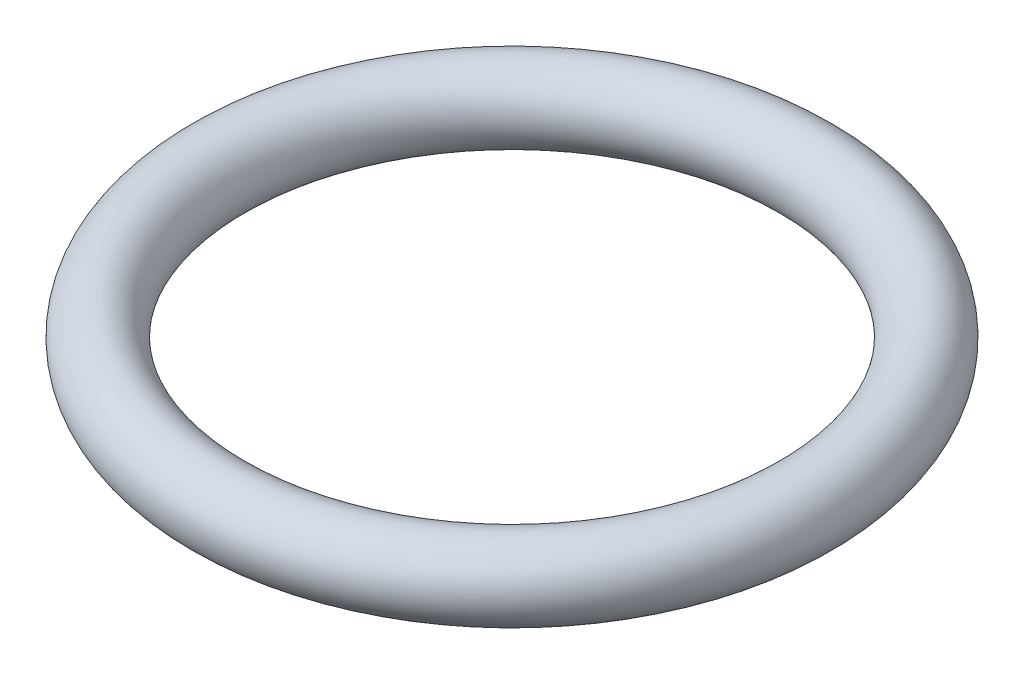
ISO-10303-21;
HEADER;
FILE_DESCRIPTION(('STEP AP214'),'2;1');
FILE_NAME('part.step','',(''),(''),'','','');
FILE_SCHEMA(('AUTOMOTIVE_DESIGN { 1 0 10303 214 1 1 1 1 }'));
ENDSEC;
DATA;
#1=APPLICATION_CONTEXT('core data for automotive mechanical design processes');
#2=APPLICATION_PROTOCOL_DEFINITION('international standard','automotive_design',2000,#1);
#3=PRODUCT_CONTEXT('',#1,'mechanical');
#4=PRODUCT('Part','Part','',(#3));
#5=PRODUCT_RELATED_PRODUCT_CATEGORY('part','',(#4));
#6=PRODUCT_DEFINITION_FORMATION('','',#4);
#7=PRODUCT_DEFINITION_CONTEXT('part definition',#1,'design');
#8=PRODUCT_DEFINITION('design','',#6,#7);
#9=PRODUCT_DEFINITION_SHAPE('','',#8);
#10=(LENGTH_UNIT() NAMED_UNIT(*) SI_UNIT(.MILLI.,.METRE.));
#11=(NAMED_UNIT(*) PLANE_ANGLE_UNIT() SI_UNIT($,.RADIAN.));
#12=(NAMED_UNIT(*) SI_UNIT($,.STERADIAN.) SOLID_ANGLE_UNIT());
#13=UNCERTAINTY_MEASURE_WITH_UNIT(LENGTH_MEASURE(1.E-05),#10,'distance_accuracy_value','');
#14=(GEOMETRIC_REPRESENTATION_CONTEXT(3) GLOBAL_UNCERTAINTY_ASSIGNED_CONTEXT((#13)) GLOBAL_UNIT_ASSIGNED_CONTEXT((#10,
#11,#12)) REPRESENTATION_CONTEXT('',''));
#15=CARTESIAN_POINT('',(0.,0.,0.));
#16=DIRECTION('',(0.,0.,1.));
#17=DIRECTION('',(1.,0.,0.));
#18=AXIS2_PLACEMENT_3D('',#15,#16,#17);
#19=CARTESIAN_POINT('',(0.,0.,0.));
#20=DIRECTION('',(0.,1.,0.));
#21=DIRECTION('',(0.,0.,1.));
#22=AXIS2_PLACEMENT_3D('',#19,#20,#21);
#23=TOROIDAL_SURFACE('',#22,26.,3.25);
#24=CARTESIAN_POINT('',(0.,0.,29.25));
#25=VERTEX_POINT('',#24);
#26=VERTEX_LOOP('',#25);
#27=FACE_BOUND('',#26,.T.);
#28=ADVANCED_FACE('F37',(#27),#23,.T.);
#29=CLOSED_SHELL('',(#28));
#30=MANIFOLD_SOLID_BREP('B2',#29);
#31=ADVANCED_BREP_SHAPE_REPRESENTATION('',(#18,#30),#14);
#32=SHAPE_DEFINITION_REPRESENTATION(#9,#31);
ENDSEC;
END-ISO-10303-21;
